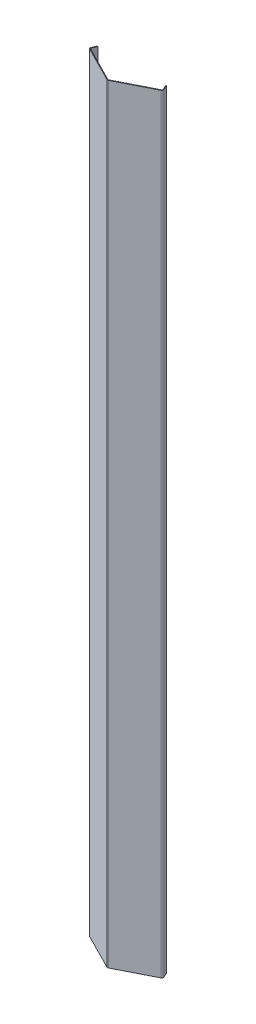
ISO-10303-21;
HEADER;
FILE_DESCRIPTION(('STEP AP214'),'2;1');
FILE_NAME('part.step','',(''),(''),'','','');
FILE_SCHEMA(('AUTOMOTIVE_DESIGN { 1 0 10303 214 1 1 1 1 }'));
ENDSEC;
DATA;
#1=APPLICATION_CONTEXT('core data for automotive mechanical design processes');
#2=APPLICATION_PROTOCOL_DEFINITION('international standard','automotive_design',2000,#1);
#3=PRODUCT_CONTEXT('',#1,'mechanical');
#4=PRODUCT('Part','Part','',(#3));
#5=PRODUCT_RELATED_PRODUCT_CATEGORY('part','',(#4));
#6=PRODUCT_DEFINITION_FORMATION('','',#4);
#7=PRODUCT_DEFINITION_CONTEXT('part definition',#1,'design');
#8=PRODUCT_DEFINITION('design','',#6,#7);
#9=PRODUCT_DEFINITION_SHAPE('','',#8);
#10=(LENGTH_UNIT() NAMED_UNIT(*) SI_UNIT(.MILLI.,.METRE.));
#11=(NAMED_UNIT(*) PLANE_ANGLE_UNIT() SI_UNIT($,.RADIAN.));
#12=(NAMED_UNIT(*) SI_UNIT($,.STERADIAN.) SOLID_ANGLE_UNIT());
#13=UNCERTAINTY_MEASURE_WITH_UNIT(LENGTH_MEASURE(1.E-05),#10,'distance_accuracy_value','');
#14=(GEOMETRIC_REPRESENTATION_CONTEXT(3) GLOBAL_UNCERTAINTY_ASSIGNED_CONTEXT((#13)) GLOBAL_UNIT_ASSIGNED_CONTEXT((#10,
#11,#12)) REPRESENTATION_CONTEXT('',''));
#15=CARTESIAN_POINT('',(0.,0.,0.));
#16=DIRECTION('',(0.,0.,1.));
#17=DIRECTION('',(1.,0.,0.));
#18=AXIS2_PLACEMENT_3D('',#15,#16,#17);
#19=CARTESIAN_POINT('',(-102.841397195583,4710.,-134.965277777778));
#20=DIRECTION('',(-0.409836101706064,0.,0.912159180043909));
#21=DIRECTION('',(0.912159180043909,0.,0.409836101706064));
#22=AXIS2_PLACEMENT_3D('',#19,#20,#21);
#23=PLANE('',#22);
#24=DIRECTION('',(-0.912159180043909,0.,-0.409836101706064));
#25=VECTOR('',#24,1.);
#26=CARTESIAN_POINT('',(-102.841397195583,0.,-134.965277777778));
#27=LINE('',#26,#25);
#28=CARTESIAN_POINT('',(-99.1927604754076,0.,-133.325933370954));
#29=VERTEX_POINT('',#28);
#30=CARTESIAN_POINT('',(-102.841397195583,0.,-134.965277777778));
#31=VERTEX_POINT('',#30);
#32=EDGE_CURVE('E177',#29,#31,#27,.T.);
#33=ORIENTED_EDGE('',*,*,#32,.T.);
#34=DIRECTION('',(0.,-1.,0.));
#35=VECTOR('',#34,1.);
#36=CARTESIAN_POINT('',(-102.841397195583,4710.,-134.965277777778));
#37=LINE('',#36,#35);
#38=CARTESIAN_POINT('',(-102.841397195583,4710.,-134.965277777778));
#39=VERTEX_POINT('',#38);
#40=EDGE_CURVE('E11',#39,#31,#37,.T.);
#41=ORIENTED_EDGE('',*,*,#40,.F.);
#42=DIRECTION('',(-0.912159180043909,0.,-0.409836101706064));
#43=VECTOR('',#42,1.);
#44=CARTESIAN_POINT('',(-102.841397195583,4710.,-134.965277777778));
#45=LINE('',#44,#43);
#46=CARTESIAN_POINT('',(-99.1927604754076,4710.,-133.325933370954));
#47=VERTEX_POINT('',#46);
#48=EDGE_CURVE('E207',#47,#39,#45,.T.);
#49=ORIENTED_EDGE('',*,*,#48,.F.);
#50=DIRECTION('',(0.,-1.,0.));
#51=VECTOR('',#50,1.);
#52=CARTESIAN_POINT('',(-99.1927604754076,4710.,-133.325933370954));
#53=LINE('',#52,#51);
#54=EDGE_CURVE('E173',#47,#29,#53,.T.);
#55=ORIENTED_EDGE('',*,*,#54,.T.);
#56=EDGE_LOOP('',(#33,#41,#49,#55));
#57=FACE_BOUND('',#56,.T.);
#58=ADVANCED_FACE('F33',(#57),#23,.F.);
#59=CARTESIAN_POINT('',(-102.841397195583,4710.,-134.965277777778));
#60=DIRECTION('',(0.91215918004391,0.,0.409836101706063));
#61=DIRECTION('',(0.409836101706063,0.,-0.91215918004391));
#62=AXIS2_PLACEMENT_3D('',#59,#60,#61);
#63=PLANE('',#62);
#64=DIRECTION('',(-0.409836101706063,0.,0.91215918004391));
#65=VECTOR('',#64,1.);
#66=CARTESIAN_POINT('',(-102.841397195583,0.,-134.965277777778));
#67=LINE('',#66,#65);
#68=CARTESIAN_POINT('',(-115.114033485366,0.,-107.65046141957));
#69=VERTEX_POINT('',#68);
#70=EDGE_CURVE('E180',#31,#69,#67,.T.);
#71=ORIENTED_EDGE('',*,*,#70,.T.);
#72=DIRECTION('',(0.,-1.,0.));
#73=VECTOR('',#72,1.);
#74=CARTESIAN_POINT('',(-115.114033485366,4710.,-107.65046141957));
#75=LINE('',#74,#73);
#76=CARTESIAN_POINT('',(-115.114033485366,4710.,-107.65046141957));
#77=VERTEX_POINT('',#76);
#78=EDGE_CURVE('E41',#77,#69,#75,.T.);
#79=ORIENTED_EDGE('',*,*,#78,.F.);
#80=DIRECTION('',(-0.409836101706063,0.,0.91215918004391));
#81=VECTOR('',#80,1.);
#82=CARTESIAN_POINT('',(-102.841397195583,4710.,-134.965277777778));
#83=LINE('',#82,#81);
#84=EDGE_CURVE('E116',#39,#77,#83,.T.);
#85=ORIENTED_EDGE('',*,*,#84,.F.);
#86=ORIENTED_EDGE('',*,*,#40,.T.);
#87=EDGE_LOOP('',(#71,#79,#85,#86));
#88=FACE_BOUND('',#87,.T.);
#89=ADVANCED_FACE('F305',(#88),#63,.F.);
#90=CARTESIAN_POINT('',(-105.992441684927,4710.,-103.552100402509));
#91=DIRECTION('',(0.,-1.,0.));
#92=DIRECTION('',(0.,0.,-1.));
#93=AXIS2_PLACEMENT_3D('',#90,#91,#92);
#94=CYLINDRICAL_SURFACE('',#93,10.);
#95=CARTESIAN_POINT('',(-105.992441684927,0.,-103.552100402509));
#96=DIRECTION('',(0.,1.,0.));
#97=DIRECTION('',(0.,0.,1.));
#98=AXIS2_PLACEMENT_3D('',#95,#96,#97);
#99=CIRCLE('',#98,10.);
#100=CARTESIAN_POINT('',(-110.511946464936,0.,-94.6316701133653));
#101=VERTEX_POINT('',#100);
#102=EDGE_CURVE('E182',#69,#101,#99,.T.);
#103=ORIENTED_EDGE('',*,*,#102,.T.);
#104=DIRECTION('',(0.,-1.,0.));
#105=VECTOR('',#104,1.);
#106=CARTESIAN_POINT('',(-110.511946464936,4710.,-94.6316701133653));
#107=LINE('',#106,#105);
#108=CARTESIAN_POINT('',(-110.511946464936,4710.,-94.6316701133653));
#109=VERTEX_POINT('',#108);
#110=EDGE_CURVE('E238',#109,#101,#107,.T.);
#111=ORIENTED_EDGE('',*,*,#110,.F.);
#112=CARTESIAN_POINT('',(-105.992441684927,4710.,-103.552100402509));
#113=DIRECTION('',(0.,1.,0.));
#114=DIRECTION('',(0.,0.,1.));
#115=AXIS2_PLACEMENT_3D('',#112,#113,#114);
#116=CIRCLE('',#115,10.);
#117=EDGE_CURVE('E246',#77,#109,#116,.T.);
#118=ORIENTED_EDGE('',*,*,#117,.F.);
#119=ORIENTED_EDGE('',*,*,#78,.T.);
#120=EDGE_LOOP('',(#103,#111,#118,#119));
#121=FACE_BOUND('',#120,.T.);
#122=ADVANCED_FACE('F244',(#121),#94,.T.);
#123=CARTESIAN_POINT('',(103.67090773331,4710.,13.8833232186408));
#124=DIRECTION('',(0.451950478000949,0.,-0.892043028914365));
#125=DIRECTION('',(-0.892043028914365,0.,-0.451950478000949));
#126=AXIS2_PLACEMENT_3D('',#123,#124,#125);
#127=PLANE('',#126);
#128=DIRECTION('',(0.892043028914365,0.,0.451950478000949));
#129=VECTOR('',#128,1.);
#130=CARTESIAN_POINT('',(103.67090773331,0.,13.8833232186408));
#131=LINE('',#130,#129);
#132=CARTESIAN_POINT('',(103.67090773331,0.,13.8833232186408));
#133=VERTEX_POINT('',#132);
#134=EDGE_CURVE('E184',#101,#133,#131,.T.);
#135=ORIENTED_EDGE('',*,*,#134,.T.);
#136=DIRECTION('',(0.,-1.,0.));
#137=VECTOR('',#136,1.);
#138=CARTESIAN_POINT('',(103.67090773331,4710.,13.8833232186408));
#139=LINE('',#138,#137);
#140=CARTESIAN_POINT('',(103.67090773331,4710.,13.8833232186408));
#141=VERTEX_POINT('',#140);
#142=EDGE_CURVE('E235',#141,#133,#139,.T.);
#143=ORIENTED_EDGE('',*,*,#142,.F.);
#144=DIRECTION('',(0.892043028914365,0.,0.451950478000949));
#145=VECTOR('',#144,1.);
#146=CARTESIAN_POINT('',(103.67090773331,4710.,13.8833232186408));
#147=LINE('',#146,#145);
#148=EDGE_CURVE('E264',#109,#141,#147,.T.);
#149=ORIENTED_EDGE('',*,*,#148,.F.);
#150=ORIENTED_EDGE('',*,*,#110,.T.);
#151=EDGE_LOOP('',(#135,#143,#149,#150));
#152=FACE_BOUND('',#151,.T.);
#153=ADVANCED_FACE('F255',(#152),#127,.F.);
#154=CARTESIAN_POINT('',(108.19041251332,4710.,4.96289292949717));
#155=DIRECTION('',(0.,-1.,0.));
#156=DIRECTION('',(0.,0.,-1.));
#157=AXIS2_PLACEMENT_3D('',#154,#155,#156);
#158=CYLINDRICAL_SURFACE('',#157,10.);
#159=CARTESIAN_POINT('',(108.19041251332,0.,4.96289292949717));
#160=DIRECTION('',(0.,1.,0.));
#161=DIRECTION('',(0.,0.,1.));
#162=AXIS2_PLACEMENT_3D('',#159,#160,#161);
#163=CIRCLE('',#162,10.);
#164=CARTESIAN_POINT('',(112.709917293329,0.,13.8833232186408));
#165=VERTEX_POINT('',#164);
#166=EDGE_CURVE('E186',#133,#165,#163,.T.);
#167=ORIENTED_EDGE('',*,*,#166,.T.);
#168=DIRECTION('',(0.,-1.,0.));
#169=VECTOR('',#168,1.);
#170=CARTESIAN_POINT('',(112.709917293329,4710.,13.8833232186408));
#171=LINE('',#170,#169);
#172=CARTESIAN_POINT('',(112.709917293329,4710.,13.8833232186408));
#173=VERTEX_POINT('',#172);
#174=EDGE_CURVE('E232',#173,#165,#171,.T.);
#175=ORIENTED_EDGE('',*,*,#174,.F.);
#176=CARTESIAN_POINT('',(108.19041251332,4710.,4.96289292949717));
#177=DIRECTION('',(0.,1.,0.));
#178=DIRECTION('',(0.,0.,1.));
#179=AXIS2_PLACEMENT_3D('',#176,#177,#178);
#180=CIRCLE('',#179,10.);
#181=EDGE_CURVE('E261',#141,#173,#180,.T.);
#182=ORIENTED_EDGE('',*,*,#181,.F.);
#183=ORIENTED_EDGE('',*,*,#142,.T.);
#184=EDGE_LOOP('',(#167,#175,#182,#183));
#185=FACE_BOUND('',#184,.T.);
#186=ADVANCED_FACE('F259',(#185),#158,.T.);
#187=CARTESIAN_POINT('',(112.709917293329,4710.,13.8833232186408));
#188=DIRECTION('',(-0.451950478000949,0.,-0.892043028914365));
#189=DIRECTION('',(-0.892043028914365,0.,0.451950478000949));
#190=AXIS2_PLACEMENT_3D('',#187,#188,#189);
#191=PLANE('',#190);
#192=DIRECTION('',(0.892043028914365,0.,-0.451950478000949));
#193=VECTOR('',#192,1.);
#194=CARTESIAN_POINT('',(112.709917293329,0.,13.8833232186408));
#195=LINE('',#194,#193);
#196=CARTESIAN_POINT('',(326.892771491575,0.,-94.6316701133653));
#197=VERTEX_POINT('',#196);
#198=EDGE_CURVE('E188',#165,#197,#195,.T.);
#199=ORIENTED_EDGE('',*,*,#198,.T.);
#200=DIRECTION('',(0.,-1.,0.));
#201=VECTOR('',#200,1.);
#202=CARTESIAN_POINT('',(326.892771491575,4710.,-94.6316701133653));
#203=LINE('',#202,#201);
#204=CARTESIAN_POINT('',(326.892771491575,4710.,-94.6316701133653));
#205=VERTEX_POINT('',#204);
#206=EDGE_CURVE('E229',#205,#197,#203,.T.);
#207=ORIENTED_EDGE('',*,*,#206,.F.);
#208=DIRECTION('',(0.892043028914365,0.,-0.451950478000949));
#209=VECTOR('',#208,1.);
#210=CARTESIAN_POINT('',(112.709917293329,4710.,13.8833232186408));
#211=LINE('',#210,#209);
#212=EDGE_CURVE('E263',#173,#205,#211,.T.);
#213=ORIENTED_EDGE('',*,*,#212,.F.);
#214=ORIENTED_EDGE('',*,*,#174,.T.);
#215=EDGE_LOOP('',(#199,#207,#213,#214));
#216=FACE_BOUND('',#215,.T.);
#217=ADVANCED_FACE('F318',(#216),#191,.F.);
#218=CARTESIAN_POINT('',(322.373266711566,4710.,-103.552100402509));
#219=DIRECTION('',(0.,-1.,0.));
#220=DIRECTION('',(0.,0.,-1.));
#221=AXIS2_PLACEMENT_3D('',#218,#219,#220);
#222=CYLINDRICAL_SURFACE('',#221,10.);
#223=CARTESIAN_POINT('',(322.373266711566,0.,-103.552100402509));
#224=DIRECTION('',(0.,1.,0.));
#225=DIRECTION('',(0.,0.,-1.));
#226=AXIS2_PLACEMENT_3D('',#223,#224,#225);
#227=CIRCLE('',#226,10.);
#228=CARTESIAN_POINT('',(331.494858512005,0.,-107.65046141957));
#229=VERTEX_POINT('',#228);
#230=EDGE_CURVE('E190',#197,#229,#227,.T.);
#231=ORIENTED_EDGE('',*,*,#230,.T.);
#232=DIRECTION('',(0.,-1.,0.));
#233=VECTOR('',#232,1.);
#234=CARTESIAN_POINT('',(331.494858512005,4710.,-107.65046141957));
#235=LINE('',#234,#233);
#236=CARTESIAN_POINT('',(331.494858512005,4710.,-107.65046141957));
#237=VERTEX_POINT('',#236);
#238=EDGE_CURVE('E226',#237,#229,#235,.T.);
#239=ORIENTED_EDGE('',*,*,#238,.F.);
#240=CARTESIAN_POINT('',(322.373266711566,4710.,-103.552100402509));
#241=DIRECTION('',(0.,1.,0.));
#242=DIRECTION('',(0.,0.,-1.));
#243=AXIS2_PLACEMENT_3D('',#240,#241,#242);
#244=CIRCLE('',#243,10.);
#245=EDGE_CURVE('E266',#205,#237,#244,.T.);
#246=ORIENTED_EDGE('',*,*,#245,.F.);
#247=ORIENTED_EDGE('',*,*,#206,.T.);
#248=EDGE_LOOP('',(#231,#239,#246,#247));
#249=FACE_BOUND('',#248,.T.);
#250=ADVANCED_FACE('F321',(#249),#222,.T.);
#251=CARTESIAN_POINT('',(319.222222222222,4710.,-134.965277777778));
#252=DIRECTION('',(-0.91215918004391,0.,0.409836101706063));
#253=DIRECTION('',(0.409836101706063,0.,0.91215918004391));
#254=AXIS2_PLACEMENT_3D('',#251,#252,#253);
#255=PLANE('',#254);
#256=DIRECTION('',(-0.409836101706063,0.,-0.91215918004391));
#257=VECTOR('',#256,1.);
#258=CARTESIAN_POINT('',(319.222222222222,0.,-134.965277777778));
#259=LINE('',#258,#257);
#260=CARTESIAN_POINT('',(319.222222222222,0.,-134.965277777778));
#261=VERTEX_POINT('',#260);
#262=EDGE_CURVE('E192',#229,#261,#259,.T.);
#263=ORIENTED_EDGE('',*,*,#262,.T.);
#264=DIRECTION('',(0.,-1.,0.));
#265=VECTOR('',#264,1.);
#266=CARTESIAN_POINT('',(319.222222222222,4710.,-134.965277777778));
#267=LINE('',#266,#265);
#268=CARTESIAN_POINT('',(319.222222222222,4710.,-134.965277777778));
#269=VERTEX_POINT('',#268);
#270=EDGE_CURVE('E223',#269,#261,#267,.T.);
#271=ORIENTED_EDGE('',*,*,#270,.F.);
#272=DIRECTION('',(-0.409836101706063,0.,-0.91215918004391));
#273=VECTOR('',#272,1.);
#274=CARTESIAN_POINT('',(319.222222222222,4710.,-134.965277777778));
#275=LINE('',#274,#273);
#276=EDGE_CURVE('E272',#237,#269,#275,.T.);
#277=ORIENTED_EDGE('',*,*,#276,.F.);
#278=ORIENTED_EDGE('',*,*,#238,.T.);
#279=EDGE_LOOP('',(#263,#271,#277,#278));
#280=FACE_BOUND('',#279,.T.);
#281=ADVANCED_FACE('F325',(#280),#255,.F.);
#282=CARTESIAN_POINT('',(319.222222222222,4710.,-134.965277777778));
#283=DIRECTION('',(0.409836101706065,0.,0.912159180043909));
#284=DIRECTION('',(0.912159180043909,0.,-0.409836101706065));
#285=AXIS2_PLACEMENT_3D('',#282,#283,#284);
#286=PLANE('',#285);
#287=DIRECTION('',(-0.912159180043909,0.,0.409836101706065));
#288=VECTOR('',#287,1.);
#289=CARTESIAN_POINT('',(319.222222222222,0.,-134.965277777778));
#290=LINE('',#289,#288);
#291=CARTESIAN_POINT('',(315.573585502047,0.,-133.325933370954));
#292=VERTEX_POINT('',#291);
#293=EDGE_CURVE('E194',#261,#292,#290,.T.);
#294=ORIENTED_EDGE('',*,*,#293,.T.);
#295=DIRECTION('',(0.,-1.,0.));
#296=VECTOR('',#295,1.);
#297=CARTESIAN_POINT('',(315.573585502047,4710.,-133.325933370954));
#298=LINE('',#297,#296);
#299=CARTESIAN_POINT('',(315.573585502047,4710.,-133.325933370954));
#300=VERTEX_POINT('',#299);
#301=EDGE_CURVE('E220',#300,#292,#298,.T.);
#302=ORIENTED_EDGE('',*,*,#301,.F.);
#303=DIRECTION('',(-0.912159180043909,0.,0.409836101706065));
#304=VECTOR('',#303,1.);
#305=CARTESIAN_POINT('',(319.222222222222,4710.,-134.965277777778));
#306=LINE('',#305,#304);
#307=EDGE_CURVE('E274',#269,#300,#306,.T.);
#308=ORIENTED_EDGE('',*,*,#307,.F.);
#309=ORIENTED_EDGE('',*,*,#270,.T.);
#310=EDGE_LOOP('',(#294,#302,#308,#309));
#311=FACE_BOUND('',#310,.T.);
#312=ADVANCED_FACE('F329',(#311),#286,.F.);
#313=CARTESIAN_POINT('',(315.573585502047,4710.,-133.325933370954));
#314=DIRECTION('',(0.91215918004391,0.,-0.409836101706063));
#315=DIRECTION('',(-0.409836101706063,0.,-0.91215918004391));
#316=AXIS2_PLACEMENT_3D('',#313,#314,#315);
#317=PLANE('',#316);
#318=DIRECTION('',(0.409836101706063,0.,0.91215918004391));
#319=VECTOR('',#318,1.);
#320=CARTESIAN_POINT('',(315.573585502047,0.,-133.325933370954));
#321=LINE('',#320,#319);
#322=CARTESIAN_POINT('',(327.846221791829,0.,-106.011117012745));
#323=VERTEX_POINT('',#322);
#324=EDGE_CURVE('E196',#292,#323,#321,.T.);
#325=ORIENTED_EDGE('',*,*,#324,.T.);
#326=DIRECTION('',(0.,-1.,0.));
#327=VECTOR('',#326,1.);
#328=CARTESIAN_POINT('',(327.846221791829,4710.,-106.011117012745));
#329=LINE('',#328,#327);
#330=CARTESIAN_POINT('',(327.846221791829,4710.,-106.011117012745));
#331=VERTEX_POINT('',#330);
#332=EDGE_CURVE('E217',#331,#323,#329,.T.);
#333=ORIENTED_EDGE('',*,*,#332,.F.);
#334=DIRECTION('',(0.409836101706063,0.,0.91215918004391));
#335=VECTOR('',#334,1.);
#336=CARTESIAN_POINT('',(315.573585502047,4710.,-133.325933370954));
#337=LINE('',#336,#335);
#338=EDGE_CURVE('E276',#300,#331,#337,.T.);
#339=ORIENTED_EDGE('',*,*,#338,.F.);
#340=ORIENTED_EDGE('',*,*,#301,.T.);
#341=EDGE_LOOP('',(#325,#333,#339,#340));
#342=FACE_BOUND('',#341,.T.);
#343=ADVANCED_FACE('F333',(#342),#317,.F.);
#344=CARTESIAN_POINT('',(322.373266711566,4710.,-103.552100402509));
#345=DIRECTION('',(0.,-1.,0.));
#346=DIRECTION('',(0.,0.,-1.));
#347=AXIS2_PLACEMENT_3D('',#344,#345,#346);
#348=CYLINDRICAL_SURFACE('',#347,6.);
#349=CARTESIAN_POINT('',(322.373266711566,0.,-103.552100402509));
#350=DIRECTION('',(0.,-1.,0.));
#351=DIRECTION('',(0.,0.,-1.));
#352=AXIS2_PLACEMENT_3D('',#349,#350,#351);
#353=CIRCLE('',#352,6.);
#354=CARTESIAN_POINT('',(325.084969579571,0.,-98.1998422290227));
#355=VERTEX_POINT('',#354);
#356=EDGE_CURVE('E198',#323,#355,#353,.T.);
#357=ORIENTED_EDGE('',*,*,#356,.T.);
#358=DIRECTION('',(0.,-1.,0.));
#359=VECTOR('',#358,1.);
#360=CARTESIAN_POINT('',(325.084969579571,4710.,-98.1998422290227));
#361=LINE('',#360,#359);
#362=CARTESIAN_POINT('',(325.084969579571,4710.,-98.1998422290227));
#363=VERTEX_POINT('',#362);
#364=EDGE_CURVE('E214',#363,#355,#361,.T.);
#365=ORIENTED_EDGE('',*,*,#364,.F.);
#366=CARTESIAN_POINT('',(322.373266711566,4710.,-103.552100402509));
#367=DIRECTION('',(0.,-1.,0.));
#368=DIRECTION('',(0.,0.,-1.));
#369=AXIS2_PLACEMENT_3D('',#366,#367,#368);
#370=CIRCLE('',#369,6.);
#371=EDGE_CURVE('E278',#331,#363,#370,.T.);
#372=ORIENTED_EDGE('',*,*,#371,.F.);
#373=ORIENTED_EDGE('',*,*,#332,.T.);
#374=EDGE_LOOP('',(#357,#365,#372,#373));
#375=FACE_BOUND('',#374,.T.);
#376=ADVANCED_FACE('F337',(#375),#348,.F.);
#377=CARTESIAN_POINT('',(110.902115381325,4710.,10.3151511029834));
#378=DIRECTION('',(0.451950478000949,0.,0.892043028914365));
#379=DIRECTION('',(0.892043028914365,0.,-0.451950478000949));
#380=AXIS2_PLACEMENT_3D('',#377,#378,#379);
#381=PLANE('',#380);
#382=DIRECTION('',(-0.892043028914365,0.,0.451950478000949));
#383=VECTOR('',#382,1.);
#384=CARTESIAN_POINT('',(110.902115381325,0.,10.3151511029834));
#385=LINE('',#384,#383);
#386=CARTESIAN_POINT('',(110.902115381325,0.,10.3151511029834));
#387=VERTEX_POINT('',#386);
#388=EDGE_CURVE('E200',#355,#387,#385,.T.);
#389=ORIENTED_EDGE('',*,*,#388,.T.);
#390=DIRECTION('',(0.,-1.,0.));
#391=VECTOR('',#390,1.);
#392=CARTESIAN_POINT('',(110.902115381325,4710.,10.3151511029834));
#393=LINE('',#392,#391);
#394=CARTESIAN_POINT('',(110.902115381325,4710.,10.3151511029834));
#395=VERTEX_POINT('',#394);
#396=EDGE_CURVE('E211',#395,#387,#393,.T.);
#397=ORIENTED_EDGE('',*,*,#396,.F.);
#398=DIRECTION('',(-0.892043028914365,0.,0.451950478000949));
#399=VECTOR('',#398,1.);
#400=CARTESIAN_POINT('',(110.902115381325,4710.,10.3151511029834));
#401=LINE('',#400,#399);
#402=EDGE_CURVE('E280',#363,#395,#401,.T.);
#403=ORIENTED_EDGE('',*,*,#402,.F.);
#404=ORIENTED_EDGE('',*,*,#364,.T.);
#405=EDGE_LOOP('',(#389,#397,#403,#404));
#406=FACE_BOUND('',#405,.T.);
#407=ADVANCED_FACE('F286',(#406),#381,.F.);
#408=CARTESIAN_POINT('',(108.19041251332,4710.,4.96289292949717));
#409=DIRECTION('',(0.,-1.,0.));
#410=DIRECTION('',(0.,0.,-1.));
#411=AXIS2_PLACEMENT_3D('',#408,#409,#410);
#412=CYLINDRICAL_SURFACE('',#411,6.00000000000002);
#413=CARTESIAN_POINT('',(108.19041251332,0.,4.96289292949717));
#414=DIRECTION('',(0.,-1.,0.));
#415=DIRECTION('',(0.,0.,1.));
#416=AXIS2_PLACEMENT_3D('',#413,#414,#415);
#417=CIRCLE('',#416,6.00000000000002);
#418=CARTESIAN_POINT('',(105.478709645314,0.,10.3151511029834));
#419=VERTEX_POINT('',#418);
#420=EDGE_CURVE('E202',#387,#419,#417,.T.);
#421=ORIENTED_EDGE('',*,*,#420,.T.);
#422=DIRECTION('',(0.,-1.,0.));
#423=VECTOR('',#422,1.);
#424=CARTESIAN_POINT('',(105.478709645314,4710.,10.3151511029834));
#425=LINE('',#424,#423);
#426=CARTESIAN_POINT('',(105.478709645314,4710.,10.3151511029834));
#427=VERTEX_POINT('',#426);
#428=EDGE_CURVE('E168',#427,#419,#425,.T.);
#429=ORIENTED_EDGE('',*,*,#428,.F.);
#430=CARTESIAN_POINT('',(108.19041251332,4710.,4.96289292949717));
#431=DIRECTION('',(0.,-1.,0.));
#432=DIRECTION('',(0.,0.,1.));
#433=AXIS2_PLACEMENT_3D('',#430,#431,#432);
#434=CIRCLE('',#433,6.00000000000002);
#435=EDGE_CURVE('E159',#395,#427,#434,.T.);
#436=ORIENTED_EDGE('',*,*,#435,.F.);
#437=ORIENTED_EDGE('',*,*,#396,.T.);
#438=EDGE_LOOP('',(#421,#429,#436,#437));
#439=FACE_BOUND('',#438,.T.);
#440=ADVANCED_FACE('F290',(#439),#412,.F.);
#441=CARTESIAN_POINT('',(105.478709645314,4710.,10.3151511029834));
#442=DIRECTION('',(-0.451950478000949,0.,0.892043028914365));
#443=DIRECTION('',(0.892043028914365,0.,0.451950478000949));
#444=AXIS2_PLACEMENT_3D('',#441,#442,#443);
#445=PLANE('',#444);
#446=DIRECTION('',(-0.892043028914365,0.,-0.451950478000949));
#447=VECTOR('',#446,1.);
#448=CARTESIAN_POINT('',(105.478709645314,0.,10.3151511029834));
#449=LINE('',#448,#447);
#450=CARTESIAN_POINT('',(-108.704144552932,0.,-98.1998422290227));
#451=VERTEX_POINT('',#450);
#452=EDGE_CURVE('E167',#419,#451,#449,.T.);
#453=ORIENTED_EDGE('',*,*,#452,.T.);
#454=DIRECTION('',(0.,-1.,0.));
#455=VECTOR('',#454,1.);
#456=CARTESIAN_POINT('',(-108.704144552932,4710.,-98.1998422290227));
#457=LINE('',#456,#455);
#458=CARTESIAN_POINT('',(-108.704144552932,4710.,-98.1998422290227));
#459=VERTEX_POINT('',#458);
#460=EDGE_CURVE('E164',#459,#451,#457,.T.);
#461=ORIENTED_EDGE('',*,*,#460,.F.);
#462=DIRECTION('',(-0.892043028914365,0.,-0.451950478000949));
#463=VECTOR('',#462,1.);
#464=CARTESIAN_POINT('',(105.478709645314,4710.,10.3151511029834));
#465=LINE('',#464,#463);
#466=EDGE_CURVE('E153',#427,#459,#465,.T.);
#467=ORIENTED_EDGE('',*,*,#466,.F.);
#468=ORIENTED_EDGE('',*,*,#428,.T.);
#469=EDGE_LOOP('',(#453,#461,#467,#468));
#470=FACE_BOUND('',#469,.T.);
#471=ADVANCED_FACE('F165',(#470),#445,.F.);
#472=CARTESIAN_POINT('',(-105.992441684927,4710.,-103.552100402509));
#473=DIRECTION('',(0.,-1.,0.));
#474=DIRECTION('',(0.,0.,-1.));
#475=AXIS2_PLACEMENT_3D('',#472,#473,#474);
#476=CYLINDRICAL_SURFACE('',#475,5.99999999999999);
#477=CARTESIAN_POINT('',(-105.992441684927,0.,-103.552100402509));
#478=DIRECTION('',(0.,-1.,0.));
#479=DIRECTION('',(0.,0.,1.));
#480=AXIS2_PLACEMENT_3D('',#477,#478,#479);
#481=CIRCLE('',#480,5.99999999999999);
#482=CARTESIAN_POINT('',(-111.46539676519,0.,-106.011117012745));
#483=VERTEX_POINT('',#482);
#484=EDGE_CURVE('E102',#451,#483,#481,.T.);
#485=ORIENTED_EDGE('',*,*,#484,.T.);
#486=DIRECTION('',(0.,-1.,0.));
#487=VECTOR('',#486,1.);
#488=CARTESIAN_POINT('',(-111.46539676519,4710.,-106.011117012745));
#489=LINE('',#488,#487);
#490=CARTESIAN_POINT('',(-111.46539676519,4710.,-106.011117012745));
#491=VERTEX_POINT('',#490);
#492=EDGE_CURVE('E169',#491,#483,#489,.T.);
#493=ORIENTED_EDGE('',*,*,#492,.F.);
#494=CARTESIAN_POINT('',(-105.992441684927,4710.,-103.552100402509));
#495=DIRECTION('',(0.,-1.,0.));
#496=DIRECTION('',(0.,0.,1.));
#497=AXIS2_PLACEMENT_3D('',#494,#495,#496);
#498=CIRCLE('',#497,5.99999999999999);
#499=EDGE_CURVE('E157',#459,#491,#498,.T.);
#500=ORIENTED_EDGE('',*,*,#499,.F.);
#501=ORIENTED_EDGE('',*,*,#460,.T.);
#502=EDGE_LOOP('',(#485,#493,#500,#501));
#503=FACE_BOUND('',#502,.T.);
#504=ADVANCED_FACE('F171',(#503),#476,.F.);
#505=CARTESIAN_POINT('',(-99.1927604754076,4710.,-133.325933370954));
#506=DIRECTION('',(-0.91215918004391,0.,-0.409836101706063));
#507=DIRECTION('',(-0.409836101706063,0.,0.91215918004391));
#508=AXIS2_PLACEMENT_3D('',#505,#506,#507);
#509=PLANE('',#508);
#510=DIRECTION('',(0.409836101706063,0.,-0.91215918004391));
#511=VECTOR('',#510,1.);
#512=CARTESIAN_POINT('',(-99.1927604754076,0.,-133.325933370954));
#513=LINE('',#512,#511);
#514=EDGE_CURVE('E108',#483,#29,#513,.T.);
#515=ORIENTED_EDGE('',*,*,#514,.T.);
#516=ORIENTED_EDGE('',*,*,#54,.F.);
#517=DIRECTION('',(0.409836101706063,0.,-0.91215918004391));
#518=VECTOR('',#517,1.);
#519=CARTESIAN_POINT('',(-99.1927604754076,4710.,-133.325933370954));
#520=LINE('',#519,#518);
#521=EDGE_CURVE('E49',#491,#47,#520,.T.);
#522=ORIENTED_EDGE('',*,*,#521,.F.);
#523=ORIENTED_EDGE('',*,*,#492,.T.);
#524=EDGE_LOOP('',(#515,#516,#522,#523));
#525=FACE_BOUND('',#524,.T.);
#526=ADVANCED_FACE('F294',(#525),#509,.F.);
#527=CARTESIAN_POINT('',(-105.992441684927,4710.,-103.552100402509));
#528=DIRECTION('',(0.,1.,0.));
#529=DIRECTION('',(0.,0.,1.));
#530=AXIS2_PLACEMENT_3D('',#527,#528,#529);
#531=PLANE('',#530);
#532=ORIENTED_EDGE('',*,*,#48,.T.);
#533=ORIENTED_EDGE('',*,*,#84,.T.);
#534=ORIENTED_EDGE('',*,*,#117,.T.);
#535=ORIENTED_EDGE('',*,*,#148,.T.);
#536=ORIENTED_EDGE('',*,*,#181,.T.);
#537=ORIENTED_EDGE('',*,*,#212,.T.);
#538=ORIENTED_EDGE('',*,*,#245,.T.);
#539=ORIENTED_EDGE('',*,*,#276,.T.);
#540=ORIENTED_EDGE('',*,*,#307,.T.);
#541=ORIENTED_EDGE('',*,*,#338,.T.);
#542=ORIENTED_EDGE('',*,*,#371,.T.);
#543=ORIENTED_EDGE('',*,*,#402,.T.);
#544=ORIENTED_EDGE('',*,*,#435,.T.);
#545=ORIENTED_EDGE('',*,*,#466,.T.);
#546=ORIENTED_EDGE('',*,*,#499,.T.);
#547=ORIENTED_EDGE('',*,*,#521,.T.);
#548=EDGE_LOOP('',(#532,#533,#534,#535,#536,#537,#538,#539,#540,#541,#542,#543,#544,#545,#546,#547));
#549=FACE_BOUND('',#548,.T.);
#550=ADVANCED_FACE('F155',(#549),#531,.T.);
#551=CARTESIAN_POINT('',(-105.992441684927,0.,-103.552100402509));
#552=DIRECTION('',(0.,1.,0.));
#553=DIRECTION('',(0.,0.,1.));
#554=AXIS2_PLACEMENT_3D('',#551,#552,#553);
#555=PLANE('',#554);
#556=ORIENTED_EDGE('',*,*,#32,.F.);
#557=ORIENTED_EDGE('',*,*,#514,.F.);
#558=ORIENTED_EDGE('',*,*,#484,.F.);
#559=ORIENTED_EDGE('',*,*,#452,.F.);
#560=ORIENTED_EDGE('',*,*,#420,.F.);
#561=ORIENTED_EDGE('',*,*,#388,.F.);
#562=ORIENTED_EDGE('',*,*,#356,.F.);
#563=ORIENTED_EDGE('',*,*,#324,.F.);
#564=ORIENTED_EDGE('',*,*,#293,.F.);
#565=ORIENTED_EDGE('',*,*,#262,.F.);
#566=ORIENTED_EDGE('',*,*,#230,.F.);
#567=ORIENTED_EDGE('',*,*,#198,.F.);
#568=ORIENTED_EDGE('',*,*,#166,.F.);
#569=ORIENTED_EDGE('',*,*,#134,.F.);
#570=ORIENTED_EDGE('',*,*,#102,.F.);
#571=ORIENTED_EDGE('',*,*,#70,.F.);
#572=EDGE_LOOP('',(#556,#557,#558,#559,#560,#561,#562,#563,#564,#565,#566,#567,#568,#569,#570,#571));
#573=FACE_BOUND('',#572,.T.);
#574=ADVANCED_FACE('F250',(#573),#555,.F.);
#575=CLOSED_SHELL('',(#58,#89,#122,#153,#186,#217,#250,#281,#312,#343,#376,#407,#440,#471,#504,
#526,#550,#574));
#576=MANIFOLD_SOLID_BREP('B2',#575);
#577=ADVANCED_BREP_SHAPE_REPRESENTATION('',(#18,#576),#14);
#578=SHAPE_DEFINITION_REPRESENTATION(#9,#577);
ENDSEC;
END-ISO-10303-21;
